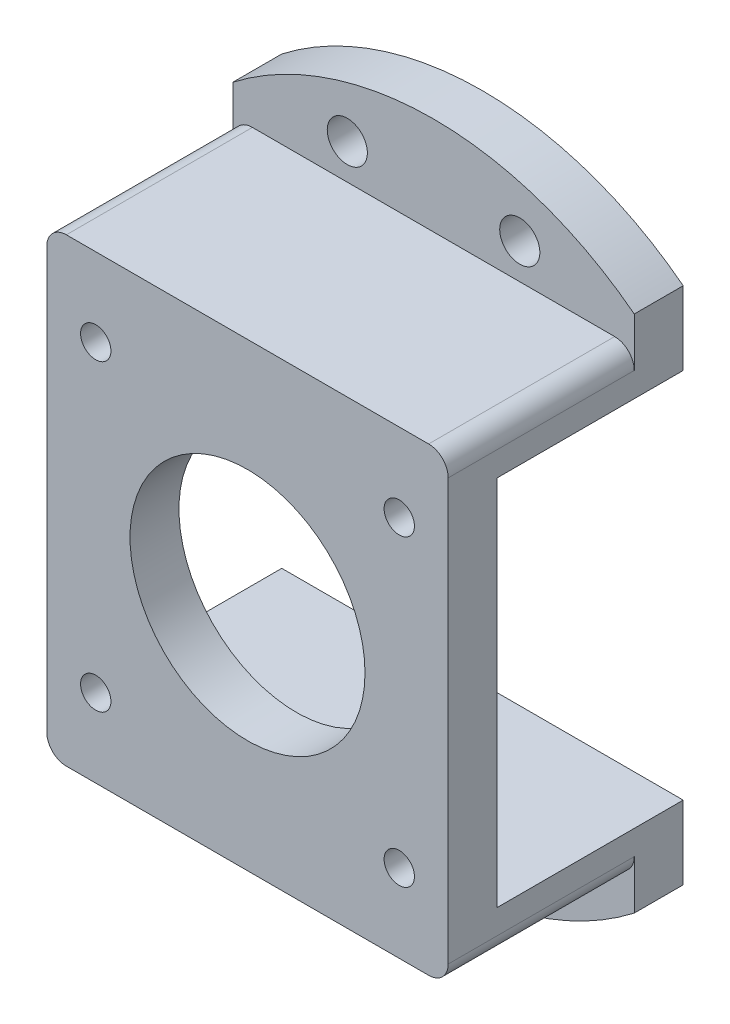
ISO-10303-21;
HEADER;
FILE_DESCRIPTION(('STEP AP214'),'2;1');
FILE_NAME('part.step','',(''),(''),'','','');
FILE_SCHEMA(('AUTOMOTIVE_DESIGN { 1 0 10303 214 1 1 1 1 }'));
ENDSEC;
DATA;
#1=APPLICATION_CONTEXT('core data for automotive mechanical design processes');
#2=APPLICATION_PROTOCOL_DEFINITION('international standard','automotive_design',2000,#1);
#3=PRODUCT_CONTEXT('',#1,'mechanical');
#4=PRODUCT('Part','Part','',(#3));
#5=PRODUCT_RELATED_PRODUCT_CATEGORY('part','',(#4));
#6=PRODUCT_DEFINITION_FORMATION('','',#4);
#7=PRODUCT_DEFINITION_CONTEXT('part definition',#1,'design');
#8=PRODUCT_DEFINITION('design','',#6,#7);
#9=PRODUCT_DEFINITION_SHAPE('','',#8);
#10=(LENGTH_UNIT() NAMED_UNIT(*) SI_UNIT(.MILLI.,.METRE.));
#11=(NAMED_UNIT(*) PLANE_ANGLE_UNIT() SI_UNIT($,.RADIAN.));
#12=(NAMED_UNIT(*) SI_UNIT($,.STERADIAN.) SOLID_ANGLE_UNIT());
#13=UNCERTAINTY_MEASURE_WITH_UNIT(LENGTH_MEASURE(1.E-05),#10,'distance_accuracy_value','');
#14=(GEOMETRIC_REPRESENTATION_CONTEXT(3) GLOBAL_UNCERTAINTY_ASSIGNED_CONTEXT((#13)) GLOBAL_UNIT_ASSIGNED_CONTEXT((#10,
#11,#12)) REPRESENTATION_CONTEXT('',''));
#15=CARTESIAN_POINT('',(0.,0.,0.));
#16=DIRECTION('',(0.,0.,1.));
#17=DIRECTION('',(1.,0.,0.));
#18=AXIS2_PLACEMENT_3D('',#15,#16,#17);
#19=CARTESIAN_POINT('',(-20.5,23.5,-19.));
#20=DIRECTION('',(0.,1.,0.));
#21=DIRECTION('',(0.,0.,1.));
#22=AXIS2_PLACEMENT_3D('',#19,#20,#21);
#23=PLANE('',#22);
#24=DIRECTION('',(-1.,0.,0.));
#25=VECTOR('',#24,1.);
#26=CARTESIAN_POINT('',(0.,23.5,-14.));
#27=LINE('',#26,#25);
#28=CARTESIAN_POINT('',(18.5,23.5,-14.));
#29=VERTEX_POINT('',#28);
#30=CARTESIAN_POINT('',(-18.5,23.5,-14.));
#31=VERTEX_POINT('',#30);
#32=EDGE_CURVE('E210',#29,#31,#27,.T.);
#33=ORIENTED_EDGE('',*,*,#32,.T.);
#34=DIRECTION('',(0.,0.,1.));
#35=VECTOR('',#34,1.);
#36=CARTESIAN_POINT('',(-18.5,23.5,-19.));
#37=LINE('',#36,#35);
#38=CARTESIAN_POINT('',(-18.5,23.5,5.));
#39=VERTEX_POINT('',#38);
#40=EDGE_CURVE('E329',#31,#39,#37,.T.);
#41=ORIENTED_EDGE('',*,*,#40,.T.);
#42=DIRECTION('',(-1.,0.,0.));
#43=VECTOR('',#42,1.);
#44=CARTESIAN_POINT('',(-20.5,23.5,5.));
#45=LINE('',#44,#43);
#46=CARTESIAN_POINT('',(18.5,23.5,5.));
#47=VERTEX_POINT('',#46);
#48=EDGE_CURVE('E239',#47,#39,#45,.T.);
#49=ORIENTED_EDGE('',*,*,#48,.F.);
#50=DIRECTION('',(0.,0.,1.));
#51=VECTOR('',#50,1.);
#52=CARTESIAN_POINT('',(18.5,23.5,-14.));
#53=LINE('',#52,#51);
#54=EDGE_CURVE('E57',#47,#29,#53,.F.);
#55=ORIENTED_EDGE('',*,*,#54,.T.);
#56=EDGE_LOOP('',(#33,#41,#49,#55));
#57=FACE_BOUND('',#56,.T.);
#58=ADVANCED_FACE('F36',(#57),#23,.T.);
#59=CARTESIAN_POINT('',(20.5,0.,5.));
#60=DIRECTION('',(-1.,0.,0.));
#61=DIRECTION('',(0.,0.,1.));
#62=AXIS2_PLACEMENT_3D('',#59,#60,#61);
#63=PLANE('',#62);
#64=DIRECTION('',(0.,1.,0.));
#65=VECTOR('',#64,1.);
#66=CARTESIAN_POINT('',(20.5,0.,5.));
#67=LINE('',#66,#65);
#68=CARTESIAN_POINT('',(20.5,-21.5,5.));
#69=VERTEX_POINT('',#68);
#70=CARTESIAN_POINT('',(20.5,21.5,5.));
#71=VERTEX_POINT('',#70);
#72=EDGE_CURVE('E274',#69,#71,#67,.T.);
#73=ORIENTED_EDGE('',*,*,#72,.F.);
#74=DIRECTION('',(0.,0.,1.));
#75=VECTOR('',#74,1.);
#76=CARTESIAN_POINT('',(20.5,-21.5,-14.));
#77=LINE('',#76,#75);
#78=CARTESIAN_POINT('',(20.5,-21.5,-14.));
#79=VERTEX_POINT('',#78);
#80=EDGE_CURVE('E174',#69,#79,#77,.F.);
#81=ORIENTED_EDGE('',*,*,#80,.T.);
#82=DIRECTION('',(0.,-1.,0.));
#83=VECTOR('',#82,1.);
#84=CARTESIAN_POINT('',(20.5,0.,-14.));
#85=LINE('',#84,#83);
#86=CARTESIAN_POINT('',(20.5,-26.4952825989835,-14.));
#87=VERTEX_POINT('',#86);
#88=EDGE_CURVE('E165',#79,#87,#85,.T.);
#89=ORIENTED_EDGE('',*,*,#88,.T.);
#90=DIRECTION('',(0.,0.,-1.));
#91=VECTOR('',#90,1.);
#92=CARTESIAN_POINT('',(20.5,-26.4952825989835,-14.));
#93=LINE('',#92,#91);
#94=CARTESIAN_POINT('',(20.5,-26.4952825989835,-19.));
#95=VERTEX_POINT('',#94);
#96=EDGE_CURVE('E150',#87,#95,#93,.T.);
#97=ORIENTED_EDGE('',*,*,#96,.T.);
#98=DIRECTION('',(0.,1.,0.));
#99=VECTOR('',#98,1.);
#100=CARTESIAN_POINT('',(20.5,-19.,-19.));
#101=LINE('',#100,#99);
#102=CARTESIAN_POINT('',(20.5,-19.,-19.));
#103=VERTEX_POINT('',#102);
#104=EDGE_CURVE('E228',#95,#103,#101,.T.);
#105=ORIENTED_EDGE('',*,*,#104,.T.);
#106=DIRECTION('',(0.,0.,1.));
#107=VECTOR('',#106,1.);
#108=CARTESIAN_POINT('',(20.5,-19.,-19.));
#109=LINE('',#108,#107);
#110=CARTESIAN_POINT('',(20.5,-19.,0.));
#111=VERTEX_POINT('',#110);
#112=EDGE_CURVE('E233',#103,#111,#109,.T.);
#113=ORIENTED_EDGE('',*,*,#112,.T.);
#114=DIRECTION('',(0.,1.,0.));
#115=VECTOR('',#114,1.);
#116=CARTESIAN_POINT('',(20.5,0.,0.));
#117=LINE('',#116,#115);
#118=CARTESIAN_POINT('',(20.5,19.,0.));
#119=VERTEX_POINT('',#118);
#120=EDGE_CURVE('E298',#111,#119,#117,.T.);
#121=ORIENTED_EDGE('',*,*,#120,.T.);
#122=DIRECTION('',(0.,0.,1.));
#123=VECTOR('',#122,1.);
#124=CARTESIAN_POINT('',(20.5,19.,-19.));
#125=LINE('',#124,#123);
#126=CARTESIAN_POINT('',(20.5,19.,-19.));
#127=VERTEX_POINT('',#126);
#128=EDGE_CURVE('E253',#127,#119,#125,.T.);
#129=ORIENTED_EDGE('',*,*,#128,.F.);
#130=DIRECTION('',(0.,1.,0.));
#131=VECTOR('',#130,1.);
#132=CARTESIAN_POINT('',(20.5,19.,-19.));
#133=LINE('',#132,#131);
#134=CARTESIAN_POINT('',(20.5,26.4952825989835,-19.));
#135=VERTEX_POINT('',#134);
#136=EDGE_CURVE('E248',#127,#135,#133,.T.);
#137=ORIENTED_EDGE('',*,*,#136,.T.);
#138=DIRECTION('',(0.,0.,-1.));
#139=VECTOR('',#138,1.);
#140=CARTESIAN_POINT('',(20.5,26.4952825989835,-14.));
#141=LINE('',#140,#139);
#142=CARTESIAN_POINT('',(20.5,26.4952825989835,-14.));
#143=VERTEX_POINT('',#142);
#144=EDGE_CURVE('E220',#143,#135,#141,.T.);
#145=ORIENTED_EDGE('',*,*,#144,.F.);
#146=DIRECTION('',(0.,1.,0.));
#147=VECTOR('',#146,1.);
#148=CARTESIAN_POINT('',(20.5,0.,-14.));
#149=LINE('',#148,#147);
#150=CARTESIAN_POINT('',(20.5,21.5,-14.));
#151=VERTEX_POINT('',#150);
#152=EDGE_CURVE('E208',#151,#143,#149,.T.);
#153=ORIENTED_EDGE('',*,*,#152,.F.);
#154=DIRECTION('',(0.,0.,1.));
#155=VECTOR('',#154,1.);
#156=CARTESIAN_POINT('',(20.5,21.5,5.));
#157=LINE('',#156,#155);
#158=EDGE_CURVE('E324',#151,#71,#157,.T.);
#159=ORIENTED_EDGE('',*,*,#158,.T.);
#160=EDGE_LOOP('',(#73,#81,#89,#97,#105,#113,#121,#129,#137,#145,#153,#159));
#161=FACE_BOUND('',#160,.T.);
#162=ADVANCED_FACE('F172',(#161),#63,.F.);
#163=CARTESIAN_POINT('',(15.5,15.5,5.));
#164=DIRECTION('',(0.,0.,-1.));
#165=DIRECTION('',(-1.,0.,0.));
#166=AXIS2_PLACEMENT_3D('',#163,#164,#165);
#167=CYLINDRICAL_SURFACE('',#166,1.55);
#168=CARTESIAN_POINT('',(15.5,15.5,5.));
#169=DIRECTION('',(0.,0.,1.));
#170=DIRECTION('',(1.,0.,0.));
#171=AXIS2_PLACEMENT_3D('',#168,#169,#170);
#172=CIRCLE('',#171,1.55);
#173=CARTESIAN_POINT('',(17.05,15.5,5.));
#174=VERTEX_POINT('',#173);
#175=EDGE_CURVE('E271',#174,#174,#172,.T.);
#176=ORIENTED_EDGE('',*,*,#175,.T.);
#177=EDGE_LOOP('',(#176));
#178=FACE_BOUND('',#177,.T.);
#179=CARTESIAN_POINT('',(15.5,15.5,0.));
#180=DIRECTION('',(0.,0.,1.));
#181=DIRECTION('',(1.,0.,0.));
#182=AXIS2_PLACEMENT_3D('',#179,#180,#181);
#183=CIRCLE('',#182,1.55);
#184=CARTESIAN_POINT('',(17.05,15.5,0.));
#185=VERTEX_POINT('',#184);
#186=EDGE_CURVE('E292',#185,#185,#183,.T.);
#187=ORIENTED_EDGE('',*,*,#186,.F.);
#188=EDGE_LOOP('',(#187));
#189=FACE_BOUND('',#188,.T.);
#190=ADVANCED_FACE('F375',(#178,#189),#167,.F.);
#191=CARTESIAN_POINT('',(-15.5,15.5,5.));
#192=DIRECTION('',(0.,0.,-1.));
#193=DIRECTION('',(-1.,0.,0.));
#194=AXIS2_PLACEMENT_3D('',#191,#192,#193);
#195=CYLINDRICAL_SURFACE('',#194,1.55);
#196=CARTESIAN_POINT('',(-15.5,15.5,5.));
#197=DIRECTION('',(0.,0.,1.));
#198=DIRECTION('',(1.,0.,0.));
#199=AXIS2_PLACEMENT_3D('',#196,#197,#198);
#200=CIRCLE('',#199,1.55);
#201=CARTESIAN_POINT('',(-13.95,15.5,5.));
#202=VERTEX_POINT('',#201);
#203=EDGE_CURVE('E268',#202,#202,#200,.T.);
#204=ORIENTED_EDGE('',*,*,#203,.T.);
#205=EDGE_LOOP('',(#204));
#206=FACE_BOUND('',#205,.T.);
#207=CARTESIAN_POINT('',(-15.5,15.5,0.));
#208=DIRECTION('',(0.,0.,1.));
#209=DIRECTION('',(1.,0.,0.));
#210=AXIS2_PLACEMENT_3D('',#207,#208,#209);
#211=CIRCLE('',#210,1.55);
#212=CARTESIAN_POINT('',(-13.95,15.5,0.));
#213=VERTEX_POINT('',#212);
#214=EDGE_CURVE('E289',#213,#213,#211,.T.);
#215=ORIENTED_EDGE('',*,*,#214,.F.);
#216=EDGE_LOOP('',(#215));
#217=FACE_BOUND('',#216,.T.);
#218=ADVANCED_FACE('F397',(#206,#217),#195,.F.);
#219=CARTESIAN_POINT('',(15.5,-15.5,5.));
#220=DIRECTION('',(0.,0.,-1.));
#221=DIRECTION('',(-1.,0.,0.));
#222=AXIS2_PLACEMENT_3D('',#219,#220,#221);
#223=CYLINDRICAL_SURFACE('',#222,1.55);
#224=CARTESIAN_POINT('',(15.5,-15.5,5.));
#225=DIRECTION('',(0.,0.,1.));
#226=DIRECTION('',(1.,0.,0.));
#227=AXIS2_PLACEMENT_3D('',#224,#225,#226);
#228=CIRCLE('',#227,1.55);
#229=CARTESIAN_POINT('',(17.05,-15.5,5.));
#230=VERTEX_POINT('',#229);
#231=EDGE_CURVE('E265',#230,#230,#228,.T.);
#232=ORIENTED_EDGE('',*,*,#231,.T.);
#233=EDGE_LOOP('',(#232));
#234=FACE_BOUND('',#233,.T.);
#235=CARTESIAN_POINT('',(15.5,-15.5,0.));
#236=DIRECTION('',(0.,0.,1.));
#237=DIRECTION('',(1.,0.,0.));
#238=AXIS2_PLACEMENT_3D('',#235,#236,#237);
#239=CIRCLE('',#238,1.55);
#240=CARTESIAN_POINT('',(17.05,-15.5,0.));
#241=VERTEX_POINT('',#240);
#242=EDGE_CURVE('E286',#241,#241,#239,.T.);
#243=ORIENTED_EDGE('',*,*,#242,.F.);
#244=EDGE_LOOP('',(#243));
#245=FACE_BOUND('',#244,.T.);
#246=ADVANCED_FACE('F401',(#234,#245),#223,.F.);
#247=CARTESIAN_POINT('',(-15.5,-15.5,5.));
#248=DIRECTION('',(0.,0.,-1.));
#249=DIRECTION('',(-1.,0.,0.));
#250=AXIS2_PLACEMENT_3D('',#247,#248,#249);
#251=CYLINDRICAL_SURFACE('',#250,1.55);
#252=CARTESIAN_POINT('',(-15.5,-15.5,5.));
#253=DIRECTION('',(0.,0.,1.));
#254=DIRECTION('',(1.,0.,0.));
#255=AXIS2_PLACEMENT_3D('',#252,#253,#254);
#256=CIRCLE('',#255,1.55);
#257=CARTESIAN_POINT('',(-13.95,-15.5,5.));
#258=VERTEX_POINT('',#257);
#259=EDGE_CURVE('E261',#258,#258,#256,.T.);
#260=ORIENTED_EDGE('',*,*,#259,.T.);
#261=EDGE_LOOP('',(#260));
#262=FACE_BOUND('',#261,.T.);
#263=CARTESIAN_POINT('',(-15.5,-15.5,0.));
#264=DIRECTION('',(0.,0.,1.));
#265=DIRECTION('',(1.,0.,0.));
#266=AXIS2_PLACEMENT_3D('',#263,#264,#265);
#267=CIRCLE('',#266,1.55);
#268=CARTESIAN_POINT('',(-13.95,-15.5,0.));
#269=VERTEX_POINT('',#268);
#270=EDGE_CURVE('E283',#269,#269,#267,.T.);
#271=ORIENTED_EDGE('',*,*,#270,.F.);
#272=EDGE_LOOP('',(#271));
#273=FACE_BOUND('',#272,.T.);
#274=ADVANCED_FACE('F405',(#262,#273),#251,.F.);
#275=CARTESIAN_POINT('',(0.,0.,5.));
#276=DIRECTION('',(0.,0.,-1.));
#277=DIRECTION('',(-1.,0.,0.));
#278=AXIS2_PLACEMENT_3D('',#275,#276,#277);
#279=CYLINDRICAL_SURFACE('',#278,12.);
#280=CARTESIAN_POINT('',(0.,0.,5.));
#281=DIRECTION('',(0.,0.,1.));
#282=DIRECTION('',(1.,0.,0.));
#283=AXIS2_PLACEMENT_3D('',#280,#281,#282);
#284=CIRCLE('',#283,12.);
#285=CARTESIAN_POINT('',(12.,0.,5.));
#286=VERTEX_POINT('',#285);
#287=EDGE_CURVE('E258',#286,#286,#284,.T.);
#288=ORIENTED_EDGE('',*,*,#287,.T.);
#289=EDGE_LOOP('',(#288));
#290=FACE_BOUND('',#289,.T.);
#291=CARTESIAN_POINT('',(0.,0.,0.));
#292=DIRECTION('',(0.,0.,1.));
#293=DIRECTION('',(1.,0.,0.));
#294=AXIS2_PLACEMENT_3D('',#291,#292,#293);
#295=CIRCLE('',#294,12.);
#296=CARTESIAN_POINT('',(12.,0.,0.));
#297=VERTEX_POINT('',#296);
#298=EDGE_CURVE('E255',#297,#297,#295,.T.);
#299=ORIENTED_EDGE('',*,*,#298,.F.);
#300=EDGE_LOOP('',(#299));
#301=FACE_BOUND('',#300,.T.);
#302=ADVANCED_FACE('F393',(#290,#301),#279,.F.);
#303=CARTESIAN_POINT('',(-20.5,0.,5.));
#304=DIRECTION('',(-1.,0.,0.));
#305=DIRECTION('',(0.,0.,1.));
#306=AXIS2_PLACEMENT_3D('',#303,#304,#305);
#307=PLANE('',#306);
#308=DIRECTION('',(0.,-1.,0.));
#309=VECTOR('',#308,1.);
#310=CARTESIAN_POINT('',(-20.5,0.,-14.));
#311=LINE('',#310,#309);
#312=CARTESIAN_POINT('',(-20.5,-21.5,-14.));
#313=VERTEX_POINT('',#312);
#314=CARTESIAN_POINT('',(-20.5,-26.4952825989835,-14.));
#315=VERTEX_POINT('',#314);
#316=EDGE_CURVE('E168',#313,#315,#311,.T.);
#317=ORIENTED_EDGE('',*,*,#316,.F.);
#318=DIRECTION('',(0.,0.,1.));
#319=VECTOR('',#318,1.);
#320=CARTESIAN_POINT('',(-20.5,-21.5,5.));
#321=LINE('',#320,#319);
#322=CARTESIAN_POINT('',(-20.5,-21.5,5.));
#323=VERTEX_POINT('',#322);
#324=EDGE_CURVE('E308',#313,#323,#321,.T.);
#325=ORIENTED_EDGE('',*,*,#324,.T.);
#326=DIRECTION('',(0.,1.,0.));
#327=VECTOR('',#326,1.);
#328=CARTESIAN_POINT('',(-20.5,0.,5.));
#329=LINE('',#328,#327);
#330=CARTESIAN_POINT('',(-20.5,21.5,5.));
#331=VERTEX_POINT('',#330);
#332=EDGE_CURVE('E277',#323,#331,#329,.T.);
#333=ORIENTED_EDGE('',*,*,#332,.T.);
#334=DIRECTION('',(0.,0.,1.));
#335=VECTOR('',#334,1.);
#336=CARTESIAN_POINT('',(-20.5,21.5,5.));
#337=LINE('',#336,#335);
#338=CARTESIAN_POINT('',(-20.5,21.5,-14.));
#339=VERTEX_POINT('',#338);
#340=EDGE_CURVE('E280',#331,#339,#337,.F.);
#341=ORIENTED_EDGE('',*,*,#340,.T.);
#342=DIRECTION('',(0.,1.,0.));
#343=VECTOR('',#342,1.);
#344=CARTESIAN_POINT('',(-20.5,0.,-14.));
#345=LINE('',#344,#343);
#346=CARTESIAN_POINT('',(-20.5,26.4952825989835,-14.));
#347=VERTEX_POINT('',#346);
#348=EDGE_CURVE('E202',#339,#347,#345,.T.);
#349=ORIENTED_EDGE('',*,*,#348,.T.);
#350=DIRECTION('',(0.,0.,-1.));
#351=VECTOR('',#350,1.);
#352=CARTESIAN_POINT('',(-20.5,26.4952825989835,-14.));
#353=LINE('',#352,#351);
#354=CARTESIAN_POINT('',(-20.5,26.4952825989835,-19.));
#355=VERTEX_POINT('',#354);
#356=EDGE_CURVE('E212',#347,#355,#353,.T.);
#357=ORIENTED_EDGE('',*,*,#356,.T.);
#358=DIRECTION('',(0.,-1.,0.));
#359=VECTOR('',#358,1.);
#360=CARTESIAN_POINT('',(-20.5,19.,-19.));
#361=LINE('',#360,#359);
#362=CARTESIAN_POINT('',(-20.5,19.,-19.));
#363=VERTEX_POINT('',#362);
#364=EDGE_CURVE('E242',#355,#363,#361,.T.);
#365=ORIENTED_EDGE('',*,*,#364,.T.);
#366=DIRECTION('',(0.,0.,1.));
#367=VECTOR('',#366,1.);
#368=CARTESIAN_POINT('',(-20.5,19.,-19.));
#369=LINE('',#368,#367);
#370=CARTESIAN_POINT('',(-20.5,19.,0.));
#371=VERTEX_POINT('',#370);
#372=EDGE_CURVE('E250',#363,#371,#369,.T.);
#373=ORIENTED_EDGE('',*,*,#372,.T.);
#374=DIRECTION('',(0.,1.,0.));
#375=VECTOR('',#374,1.);
#376=CARTESIAN_POINT('',(-20.5,0.,0.));
#377=LINE('',#376,#375);
#378=CARTESIAN_POINT('',(-20.5,-19.,0.));
#379=VERTEX_POINT('',#378);
#380=EDGE_CURVE('E262',#379,#371,#377,.T.);
#381=ORIENTED_EDGE('',*,*,#380,.F.);
#382=DIRECTION('',(0.,0.,1.));
#383=VECTOR('',#382,1.);
#384=CARTESIAN_POINT('',(-20.5,-19.,-19.));
#385=LINE('',#384,#383);
#386=CARTESIAN_POINT('',(-20.5,-19.,-19.));
#387=VERTEX_POINT('',#386);
#388=EDGE_CURVE('E236',#387,#379,#385,.T.);
#389=ORIENTED_EDGE('',*,*,#388,.F.);
#390=DIRECTION('',(0.,-1.,0.));
#391=VECTOR('',#390,1.);
#392=CARTESIAN_POINT('',(-20.5,-19.,-19.));
#393=LINE('',#392,#391);
#394=CARTESIAN_POINT('',(-20.5,-26.4952825989835,-19.));
#395=VERTEX_POINT('',#394);
#396=EDGE_CURVE('E226',#387,#395,#393,.T.);
#397=ORIENTED_EDGE('',*,*,#396,.T.);
#398=DIRECTION('',(0.,0.,-1.));
#399=VECTOR('',#398,1.);
#400=CARTESIAN_POINT('',(-20.5,-26.4952825989835,-14.));
#401=LINE('',#400,#399);
#402=EDGE_CURVE('E160',#315,#395,#401,.T.);
#403=ORIENTED_EDGE('',*,*,#402,.F.);
#404=EDGE_LOOP('',(#317,#325,#333,#341,#349,#357,#365,#373,#381,#389,#397,#403));
#405=FACE_BOUND('',#404,.T.);
#406=ADVANCED_FACE('F356',(#405),#307,.T.);
#407=CARTESIAN_POINT('',(0.,0.,5.));
#408=DIRECTION('',(0.,0.,1.));
#409=DIRECTION('',(1.,0.,0.));
#410=AXIS2_PLACEMENT_3D('',#407,#408,#409);
#411=PLANE('',#410);
#412=ORIENTED_EDGE('',*,*,#287,.F.);
#413=EDGE_LOOP('',(#412));
#414=FACE_BOUND('',#413,.T.);
#415=ORIENTED_EDGE('',*,*,#259,.F.);
#416=EDGE_LOOP('',(#415));
#417=FACE_BOUND('',#416,.T.);
#418=ORIENTED_EDGE('',*,*,#231,.F.);
#419=EDGE_LOOP('',(#418));
#420=FACE_BOUND('',#419,.T.);
#421=ORIENTED_EDGE('',*,*,#203,.F.);
#422=EDGE_LOOP('',(#421));
#423=FACE_BOUND('',#422,.T.);
#424=ORIENTED_EDGE('',*,*,#175,.F.);
#425=EDGE_LOOP('',(#424));
#426=FACE_BOUND('',#425,.T.);
#427=ORIENTED_EDGE('',*,*,#332,.F.);
#428=CARTESIAN_POINT('',(-18.5,-21.5,5.));
#429=DIRECTION('',(0.,0.,1.));
#430=DIRECTION('',(1.,0.,0.));
#431=AXIS2_PLACEMENT_3D('',#428,#429,#430);
#432=CIRCLE('',#431,2.);
#433=CARTESIAN_POINT('',(-18.5,-23.5,5.));
#434=VERTEX_POINT('',#433);
#435=EDGE_CURVE('E317',#323,#434,#432,.T.);
#436=ORIENTED_EDGE('',*,*,#435,.T.);
#437=DIRECTION('',(1.,0.,0.));
#438=VECTOR('',#437,1.);
#439=CARTESIAN_POINT('',(-20.5,-23.5,5.));
#440=LINE('',#439,#438);
#441=CARTESIAN_POINT('',(18.5,-23.5,5.));
#442=VERTEX_POINT('',#441);
#443=EDGE_CURVE('E223',#434,#442,#440,.T.);
#444=ORIENTED_EDGE('',*,*,#443,.T.);
#445=CARTESIAN_POINT('',(18.5,-21.5,5.));
#446=DIRECTION('',(0.,0.,1.));
#447=DIRECTION('',(1.,0.,0.));
#448=AXIS2_PLACEMENT_3D('',#445,#446,#447);
#449=CIRCLE('',#448,2.);
#450=EDGE_CURVE('E315',#442,#69,#449,.T.);
#451=ORIENTED_EDGE('',*,*,#450,.T.);
#452=ORIENTED_EDGE('',*,*,#72,.T.);
#453=CARTESIAN_POINT('',(18.5,21.5,5.));
#454=DIRECTION('',(0.,0.,1.));
#455=DIRECTION('',(1.,0.,0.));
#456=AXIS2_PLACEMENT_3D('',#453,#454,#455);
#457=CIRCLE('',#456,2.);
#458=EDGE_CURVE('E311',#71,#47,#457,.T.);
#459=ORIENTED_EDGE('',*,*,#458,.T.);
#460=ORIENTED_EDGE('',*,*,#48,.T.);
#461=CARTESIAN_POINT('',(-18.5,21.5,5.));
#462=DIRECTION('',(0.,0.,1.));
#463=DIRECTION('',(1.,0.,0.));
#464=AXIS2_PLACEMENT_3D('',#461,#462,#463);
#465=CIRCLE('',#464,2.);
#466=EDGE_CURVE('E313',#39,#331,#465,.T.);
#467=ORIENTED_EDGE('',*,*,#466,.T.);
#468=EDGE_LOOP('',(#427,#436,#444,#451,#452,#459,#460,#467));
#469=FACE_BOUND('',#468,.T.);
#470=ADVANCED_FACE('F346',(#414,#417,#420,#423,#426,#469),#411,.T.);
#471=CARTESIAN_POINT('',(0.,0.,0.));
#472=DIRECTION('',(0.,0.,1.));
#473=DIRECTION('',(1.,0.,0.));
#474=AXIS2_PLACEMENT_3D('',#471,#472,#473);
#475=PLANE('',#474);
#476=ORIENTED_EDGE('',*,*,#298,.T.);
#477=EDGE_LOOP('',(#476));
#478=FACE_BOUND('',#477,.T.);
#479=ORIENTED_EDGE('',*,*,#270,.T.);
#480=EDGE_LOOP('',(#479));
#481=FACE_BOUND('',#480,.T.);
#482=ORIENTED_EDGE('',*,*,#242,.T.);
#483=EDGE_LOOP('',(#482));
#484=FACE_BOUND('',#483,.T.);
#485=ORIENTED_EDGE('',*,*,#214,.T.);
#486=EDGE_LOOP('',(#485));
#487=FACE_BOUND('',#486,.T.);
#488=ORIENTED_EDGE('',*,*,#186,.T.);
#489=EDGE_LOOP('',(#488));
#490=FACE_BOUND('',#489,.T.);
#491=DIRECTION('',(1.,0.,0.));
#492=VECTOR('',#491,1.);
#493=CARTESIAN_POINT('',(0.,-19.,0.));
#494=LINE('',#493,#492);
#495=EDGE_CURVE('E295',#379,#111,#494,.T.);
#496=ORIENTED_EDGE('',*,*,#495,.F.);
#497=ORIENTED_EDGE('',*,*,#380,.T.);
#498=DIRECTION('',(1.,0.,0.));
#499=VECTOR('',#498,1.);
#500=CARTESIAN_POINT('',(0.,19.,0.));
#501=LINE('',#500,#499);
#502=EDGE_CURVE('E301',#371,#119,#501,.T.);
#503=ORIENTED_EDGE('',*,*,#502,.T.);
#504=ORIENTED_EDGE('',*,*,#120,.F.);
#505=EDGE_LOOP('',(#496,#497,#503,#504));
#506=FACE_BOUND('',#505,.T.);
#507=ADVANCED_FACE('F384',(#478,#481,#484,#487,#490,#506),#475,.F.);
#508=CARTESIAN_POINT('',(-20.5,19.,-19.));
#509=DIRECTION('',(0.,-1.,0.));
#510=DIRECTION('',(0.,0.,-1.));
#511=AXIS2_PLACEMENT_3D('',#508,#509,#510);
#512=PLANE('',#511);
#513=ORIENTED_EDGE('',*,*,#502,.F.);
#514=ORIENTED_EDGE('',*,*,#372,.F.);
#515=DIRECTION('',(1.,0.,0.));
#516=VECTOR('',#515,1.);
#517=CARTESIAN_POINT('',(-20.5,19.,-19.));
#518=LINE('',#517,#516);
#519=EDGE_CURVE('E245',#363,#127,#518,.T.);
#520=ORIENTED_EDGE('',*,*,#519,.T.);
#521=ORIENTED_EDGE('',*,*,#128,.T.);
#522=EDGE_LOOP('',(#513,#514,#520,#521));
#523=FACE_BOUND('',#522,.T.);
#524=ADVANCED_FACE('F381',(#523),#512,.T.);
#525=CARTESIAN_POINT('',(0.,0.,-19.));
#526=DIRECTION('',(0.,0.,-1.));
#527=DIRECTION('',(-1.,0.,0.));
#528=AXIS2_PLACEMENT_3D('',#525,#526,#527);
#529=PLANE('',#528);
#530=ORIENTED_EDGE('',*,*,#364,.F.);
#531=CARTESIAN_POINT('',(0.,0.,-19.));
#532=DIRECTION('',(0.,0.,-1.));
#533=DIRECTION('',(-1.,0.,0.));
#534=AXIS2_PLACEMENT_3D('',#531,#532,#533);
#535=CIRCLE('',#534,33.5);
#536=EDGE_CURVE('E199',#355,#135,#535,.T.);
#537=ORIENTED_EDGE('',*,*,#536,.T.);
#538=ORIENTED_EDGE('',*,*,#136,.F.);
#539=ORIENTED_EDGE('',*,*,#519,.F.);
#540=EDGE_LOOP('',(#530,#537,#538,#539));
#541=FACE_BOUND('',#540,.T.);
#542=CARTESIAN_POINT('',(-8.80698433968602,27.1051107144119,-19.));
#543=DIRECTION('',(0.,0.,-1.));
#544=DIRECTION('',(-1.,0.,0.));
#545=AXIS2_PLACEMENT_3D('',#542,#543,#544);
#546=CIRCLE('',#545,2.05);
#547=CARTESIAN_POINT('',(-10.856984339686,27.1051107144119,-19.));
#548=VERTEX_POINT('',#547);
#549=EDGE_CURVE('E193',#548,#548,#546,.T.);
#550=ORIENTED_EDGE('',*,*,#549,.F.);
#551=EDGE_LOOP('',(#550));
#552=FACE_BOUND('',#551,.T.);
#553=CARTESIAN_POINT('',(8.80698433968602,27.1051107144119,-19.));
#554=DIRECTION('',(0.,0.,-1.));
#555=DIRECTION('',(-1.,0.,0.));
#556=AXIS2_PLACEMENT_3D('',#553,#554,#555);
#557=CIRCLE('',#556,2.05);
#558=CARTESIAN_POINT('',(6.75698433968602,27.1051107144119,-19.));
#559=VERTEX_POINT('',#558);
#560=EDGE_CURVE('E215',#559,#559,#557,.F.);
#561=ORIENTED_EDGE('',*,*,#560,.T.);
#562=EDGE_LOOP('',(#561));
#563=FACE_BOUND('',#562,.T.);
#564=ADVANCED_FACE('F379',(#541,#552,#563),#529,.T.);
#565=CARTESIAN_POINT('',(-20.5,-19.,-19.));
#566=DIRECTION('',(0.,1.,0.));
#567=DIRECTION('',(0.,0.,1.));
#568=AXIS2_PLACEMENT_3D('',#565,#566,#567);
#569=PLANE('',#568);
#570=ORIENTED_EDGE('',*,*,#388,.T.);
#571=ORIENTED_EDGE('',*,*,#495,.T.);
#572=ORIENTED_EDGE('',*,*,#112,.F.);
#573=DIRECTION('',(-1.,0.,0.));
#574=VECTOR('',#573,1.);
#575=CARTESIAN_POINT('',(-20.5,-19.,-19.));
#576=LINE('',#575,#574);
#577=EDGE_CURVE('E230',#103,#387,#576,.T.);
#578=ORIENTED_EDGE('',*,*,#577,.T.);
#579=EDGE_LOOP('',(#570,#571,#572,#578));
#580=FACE_BOUND('',#579,.T.);
#581=ADVANCED_FACE('F428',(#580),#569,.T.);
#582=CARTESIAN_POINT('',(-20.5,-23.5,-19.));
#583=DIRECTION('',(0.,-1.,0.));
#584=DIRECTION('',(0.,0.,-1.));
#585=AXIS2_PLACEMENT_3D('',#582,#583,#584);
#586=PLANE('',#585);
#587=ORIENTED_EDGE('',*,*,#443,.F.);
#588=DIRECTION('',(0.,0.,1.));
#589=VECTOR('',#588,1.);
#590=CARTESIAN_POINT('',(-18.5,-23.5,-19.));
#591=LINE('',#590,#589);
#592=CARTESIAN_POINT('',(-18.5,-23.5,-14.));
#593=VERTEX_POINT('',#592);
#594=EDGE_CURVE('E322',#434,#593,#591,.F.);
#595=ORIENTED_EDGE('',*,*,#594,.T.);
#596=DIRECTION('',(-1.,0.,0.));
#597=VECTOR('',#596,1.);
#598=CARTESIAN_POINT('',(0.,-23.5,-14.));
#599=LINE('',#598,#597);
#600=CARTESIAN_POINT('',(18.5,-23.5,-14.));
#601=VERTEX_POINT('',#600);
#602=EDGE_CURVE('E161',#601,#593,#599,.T.);
#603=ORIENTED_EDGE('',*,*,#602,.F.);
#604=DIRECTION('',(0.,0.,1.));
#605=VECTOR('',#604,1.);
#606=CARTESIAN_POINT('',(18.5,-23.5,5.));
#607=LINE('',#606,#605);
#608=EDGE_CURVE('E319',#601,#442,#607,.T.);
#609=ORIENTED_EDGE('',*,*,#608,.T.);
#610=EDGE_LOOP('',(#587,#595,#603,#609));
#611=FACE_BOUND('',#610,.T.);
#612=ADVANCED_FACE('F341',(#611),#586,.T.);
#613=CARTESIAN_POINT('',(0.,0.,-19.));
#614=DIRECTION('',(0.,0.,1.));
#615=DIRECTION('',(1.,0.,0.));
#616=AXIS2_PLACEMENT_3D('',#613,#614,#615);
#617=PLANE('',#616);
#618=ORIENTED_EDGE('',*,*,#396,.F.);
#619=ORIENTED_EDGE('',*,*,#577,.F.);
#620=ORIENTED_EDGE('',*,*,#104,.F.);
#621=CARTESIAN_POINT('',(0.,0.,-19.));
#622=DIRECTION('',(0.,0.,-1.));
#623=DIRECTION('',(-1.,0.,0.));
#624=AXIS2_PLACEMENT_3D('',#621,#622,#623);
#625=CIRCLE('',#624,33.5);
#626=EDGE_CURVE('E156',#95,#395,#625,.T.);
#627=ORIENTED_EDGE('',*,*,#626,.T.);
#628=EDGE_LOOP('',(#618,#619,#620,#627));
#629=FACE_BOUND('',#628,.T.);
#630=CARTESIAN_POINT('',(8.80698433968602,-27.1051107144119,-19.));
#631=DIRECTION('',(0.,0.,-1.));
#632=DIRECTION('',(-1.,0.,0.));
#633=AXIS2_PLACEMENT_3D('',#630,#631,#632);
#634=CIRCLE('',#633,2.05);
#635=CARTESIAN_POINT('',(6.75698433968602,-27.1051107144119,-19.));
#636=VERTEX_POINT('',#635);
#637=EDGE_CURVE('E186',#636,#636,#634,.T.);
#638=ORIENTED_EDGE('',*,*,#637,.F.);
#639=EDGE_LOOP('',(#638));
#640=FACE_BOUND('',#639,.T.);
#641=CARTESIAN_POINT('',(-8.80698433968602,-27.1051107144119,-19.));
#642=DIRECTION('',(0.,0.,-1.));
#643=DIRECTION('',(-1.,0.,0.));
#644=AXIS2_PLACEMENT_3D('',#641,#642,#643);
#645=CIRCLE('',#644,2.05);
#646=CARTESIAN_POINT('',(-10.856984339686,-27.1051107144119,-19.));
#647=VERTEX_POINT('',#646);
#648=EDGE_CURVE('E189',#647,#647,#645,.F.);
#649=ORIENTED_EDGE('',*,*,#648,.T.);
#650=EDGE_LOOP('',(#649));
#651=FACE_BOUND('',#650,.T.);
#652=ADVANCED_FACE('F431',(#629,#640,#651),#617,.F.);
#653=CARTESIAN_POINT('',(8.80698433968602,27.1051107144119,-14.));
#654=DIRECTION('',(0.,0.,-1.));
#655=DIRECTION('',(-1.,0.,0.));
#656=AXIS2_PLACEMENT_3D('',#653,#654,#655);
#657=CYLINDRICAL_SURFACE('',#656,2.05);
#658=CARTESIAN_POINT('',(8.80698433968602,27.1051107144119,-14.));
#659=DIRECTION('',(0.,0.,-1.));
#660=DIRECTION('',(-1.,0.,0.));
#661=AXIS2_PLACEMENT_3D('',#658,#659,#660);
#662=CIRCLE('',#661,2.05);
#663=CARTESIAN_POINT('',(6.75698433968602,27.1051107144119,-14.));
#664=VERTEX_POINT('',#663);
#665=EDGE_CURVE('E198',#664,#664,#662,.F.);
#666=ORIENTED_EDGE('',*,*,#665,.T.);
#667=EDGE_LOOP('',(#666));
#668=FACE_BOUND('',#667,.T.);
#669=ORIENTED_EDGE('',*,*,#560,.F.);
#670=EDGE_LOOP('',(#669));
#671=FACE_BOUND('',#670,.T.);
#672=ADVANCED_FACE('F458',(#668,#671),#657,.F.);
#673=CARTESIAN_POINT('',(-8.80698433968602,27.1051107144119,-14.));
#674=DIRECTION('',(0.,0.,-1.));
#675=DIRECTION('',(-1.,0.,0.));
#676=AXIS2_PLACEMENT_3D('',#673,#674,#675);
#677=CYLINDRICAL_SURFACE('',#676,2.05);
#678=CARTESIAN_POINT('',(-8.80698433968602,27.1051107144119,-14.));
#679=DIRECTION('',(0.,0.,-1.));
#680=DIRECTION('',(-1.,0.,0.));
#681=AXIS2_PLACEMENT_3D('',#678,#679,#680);
#682=CIRCLE('',#681,2.05);
#683=CARTESIAN_POINT('',(-10.856984339686,27.1051107144119,-14.));
#684=VERTEX_POINT('',#683);
#685=EDGE_CURVE('E195',#684,#684,#682,.T.);
#686=ORIENTED_EDGE('',*,*,#685,.F.);
#687=EDGE_LOOP('',(#686));
#688=FACE_BOUND('',#687,.T.);
#689=ORIENTED_EDGE('',*,*,#549,.T.);
#690=EDGE_LOOP('',(#689));
#691=FACE_BOUND('',#690,.T.);
#692=ADVANCED_FACE('F453',(#688,#691),#677,.F.);
#693=CARTESIAN_POINT('',(0.,0.,-14.));
#694=DIRECTION('',(0.,0.,-1.));
#695=DIRECTION('',(-1.,0.,0.));
#696=AXIS2_PLACEMENT_3D('',#693,#694,#695);
#697=CYLINDRICAL_SURFACE('',#696,33.5);
#698=ORIENTED_EDGE('',*,*,#536,.F.);
#699=ORIENTED_EDGE('',*,*,#356,.F.);
#700=CARTESIAN_POINT('',(0.,0.,-14.));
#701=DIRECTION('',(0.,0.,-1.));
#702=DIRECTION('',(-1.,0.,0.));
#703=AXIS2_PLACEMENT_3D('',#700,#701,#702);
#704=CIRCLE('',#703,33.5);
#705=EDGE_CURVE('E205',#347,#143,#704,.T.);
#706=ORIENTED_EDGE('',*,*,#705,.T.);
#707=ORIENTED_EDGE('',*,*,#144,.T.);
#708=EDGE_LOOP('',(#698,#699,#706,#707));
#709=FACE_BOUND('',#708,.T.);
#710=ADVANCED_FACE('F440',(#709),#697,.T.);
#711=CARTESIAN_POINT('',(0.,0.,-14.));
#712=DIRECTION('',(0.,0.,-1.));
#713=DIRECTION('',(-1.,0.,0.));
#714=AXIS2_PLACEMENT_3D('',#711,#712,#713);
#715=PLANE('',#714);
#716=ORIENTED_EDGE('',*,*,#685,.T.);
#717=EDGE_LOOP('',(#716));
#718=FACE_BOUND('',#717,.T.);
#719=ORIENTED_EDGE('',*,*,#665,.F.);
#720=EDGE_LOOP('',(#719));
#721=FACE_BOUND('',#720,.T.);
#722=ORIENTED_EDGE('',*,*,#348,.F.);
#723=CARTESIAN_POINT('',(-18.5,21.5,-14.));
#724=DIRECTION('',(0.,0.,-1.));
#725=DIRECTION('',(-1.,0.,0.));
#726=AXIS2_PLACEMENT_3D('',#723,#724,#725);
#727=CIRCLE('',#726,2.);
#728=EDGE_CURVE('E44',#339,#31,#727,.T.);
#729=ORIENTED_EDGE('',*,*,#728,.T.);
#730=ORIENTED_EDGE('',*,*,#32,.F.);
#731=CARTESIAN_POINT('',(18.5,21.5,-14.));
#732=DIRECTION('',(0.,0.,-1.));
#733=DIRECTION('',(-1.,0.,0.));
#734=AXIS2_PLACEMENT_3D('',#731,#732,#733);
#735=CIRCLE('',#734,2.);
#736=EDGE_CURVE('E11',#29,#151,#735,.T.);
#737=ORIENTED_EDGE('',*,*,#736,.T.);
#738=ORIENTED_EDGE('',*,*,#152,.T.);
#739=ORIENTED_EDGE('',*,*,#705,.F.);
#740=EDGE_LOOP('',(#722,#729,#730,#737,#738,#739));
#741=FACE_BOUND('',#740,.T.);
#742=ADVANCED_FACE('F441',(#718,#721,#741),#715,.F.);
#743=CARTESIAN_POINT('',(-8.80698433968602,-27.1051107144119,-14.));
#744=DIRECTION('',(0.,0.,-1.));
#745=DIRECTION('',(-1.,0.,0.));
#746=AXIS2_PLACEMENT_3D('',#743,#744,#745);
#747=CYLINDRICAL_SURFACE('',#746,2.05);
#748=CARTESIAN_POINT('',(-8.80698433968602,-27.1051107144119,-14.));
#749=DIRECTION('',(0.,0.,-1.));
#750=DIRECTION('',(-1.,0.,0.));
#751=AXIS2_PLACEMENT_3D('',#748,#749,#750);
#752=CIRCLE('',#751,2.05);
#753=CARTESIAN_POINT('',(-10.856984339686,-27.1051107144119,-14.));
#754=VERTEX_POINT('',#753);
#755=EDGE_CURVE('E176',#754,#754,#752,.F.);
#756=ORIENTED_EDGE('',*,*,#755,.T.);
#757=EDGE_LOOP('',(#756));
#758=FACE_BOUND('',#757,.T.);
#759=ORIENTED_EDGE('',*,*,#648,.F.);
#760=EDGE_LOOP('',(#759));
#761=FACE_BOUND('',#760,.T.);
#762=ADVANCED_FACE('F443',(#758,#761),#747,.F.);
#763=CARTESIAN_POINT('',(8.80698433968602,-27.1051107144119,-14.));
#764=DIRECTION('',(0.,0.,-1.));
#765=DIRECTION('',(-1.,0.,0.));
#766=AXIS2_PLACEMENT_3D('',#763,#764,#765);
#767=CYLINDRICAL_SURFACE('',#766,2.05);
#768=CARTESIAN_POINT('',(8.80698433968602,-27.1051107144119,-14.));
#769=DIRECTION('',(0.,0.,-1.));
#770=DIRECTION('',(-1.,0.,0.));
#771=AXIS2_PLACEMENT_3D('',#768,#769,#770);
#772=CIRCLE('',#771,2.05);
#773=CARTESIAN_POINT('',(6.75698433968602,-27.1051107144119,-14.));
#774=VERTEX_POINT('',#773);
#775=EDGE_CURVE('E179',#774,#774,#772,.T.);
#776=ORIENTED_EDGE('',*,*,#775,.F.);
#777=EDGE_LOOP('',(#776));
#778=FACE_BOUND('',#777,.T.);
#779=ORIENTED_EDGE('',*,*,#637,.T.);
#780=EDGE_LOOP('',(#779));
#781=FACE_BOUND('',#780,.T.);
#782=ADVANCED_FACE('F450',(#778,#781),#767,.F.);
#783=CARTESIAN_POINT('',(0.,0.,-14.));
#784=DIRECTION('',(0.,0.,-1.));
#785=DIRECTION('',(-1.,0.,0.));
#786=AXIS2_PLACEMENT_3D('',#783,#784,#785);
#787=CYLINDRICAL_SURFACE('',#786,33.5);
#788=ORIENTED_EDGE('',*,*,#626,.F.);
#789=ORIENTED_EDGE('',*,*,#96,.F.);
#790=CARTESIAN_POINT('',(0.,0.,-14.));
#791=DIRECTION('',(0.,0.,-1.));
#792=DIRECTION('',(-1.,0.,0.));
#793=AXIS2_PLACEMENT_3D('',#790,#791,#792);
#794=CIRCLE('',#793,33.5);
#795=EDGE_CURVE('E154',#87,#315,#794,.T.);
#796=ORIENTED_EDGE('',*,*,#795,.T.);
#797=ORIENTED_EDGE('',*,*,#402,.T.);
#798=EDGE_LOOP('',(#788,#789,#796,#797));
#799=FACE_BOUND('',#798,.T.);
#800=ADVANCED_FACE('F152',(#799),#787,.T.);
#801=CARTESIAN_POINT('',(0.,0.,-14.));
#802=DIRECTION('',(0.,0.,-1.));
#803=DIRECTION('',(-1.,0.,0.));
#804=AXIS2_PLACEMENT_3D('',#801,#802,#803);
#805=PLANE('',#804);
#806=ORIENTED_EDGE('',*,*,#775,.T.);
#807=EDGE_LOOP('',(#806));
#808=FACE_BOUND('',#807,.T.);
#809=ORIENTED_EDGE('',*,*,#755,.F.);
#810=EDGE_LOOP('',(#809));
#811=FACE_BOUND('',#810,.T.);
#812=ORIENTED_EDGE('',*,*,#88,.F.);
#813=CARTESIAN_POINT('',(18.5,-21.5,-14.));
#814=DIRECTION('',(0.,0.,-1.));
#815=DIRECTION('',(-1.,0.,0.));
#816=AXIS2_PLACEMENT_3D('',#813,#814,#815);
#817=CIRCLE('',#816,2.);
#818=EDGE_CURVE('E334',#79,#601,#817,.T.);
#819=ORIENTED_EDGE('',*,*,#818,.T.);
#820=ORIENTED_EDGE('',*,*,#602,.T.);
#821=CARTESIAN_POINT('',(-18.5,-21.5,-14.));
#822=DIRECTION('',(0.,0.,-1.));
#823=DIRECTION('',(-1.,0.,0.));
#824=AXIS2_PLACEMENT_3D('',#821,#822,#823);
#825=CIRCLE('',#824,2.);
#826=EDGE_CURVE('E332',#593,#313,#825,.T.);
#827=ORIENTED_EDGE('',*,*,#826,.T.);
#828=ORIENTED_EDGE('',*,*,#316,.T.);
#829=ORIENTED_EDGE('',*,*,#795,.F.);
#830=EDGE_LOOP('',(#812,#819,#820,#827,#828,#829));
#831=FACE_BOUND('',#830,.T.);
#832=ADVANCED_FACE('F164',(#808,#811,#831),#805,.F.);
#833=CARTESIAN_POINT('',(-18.5,-21.5,5.));
#834=DIRECTION('',(0.,0.,1.));
#835=DIRECTION('',(1.,0.,0.));
#836=AXIS2_PLACEMENT_3D('',#833,#834,#835);
#837=CYLINDRICAL_SURFACE('',#836,2.);
#838=ORIENTED_EDGE('',*,*,#826,.F.);
#839=ORIENTED_EDGE('',*,*,#594,.F.);
#840=ORIENTED_EDGE('',*,*,#435,.F.);
#841=ORIENTED_EDGE('',*,*,#324,.F.);
#842=EDGE_LOOP('',(#838,#839,#840,#841));
#843=FACE_BOUND('',#842,.T.);
#844=ADVANCED_FACE('F359',(#843),#837,.T.);
#845=CARTESIAN_POINT('',(18.5,-21.5,-19.));
#846=DIRECTION('',(0.,0.,-1.));
#847=DIRECTION('',(-1.,0.,0.));
#848=AXIS2_PLACEMENT_3D('',#845,#846,#847);
#849=CYLINDRICAL_SURFACE('',#848,2.);
#850=ORIENTED_EDGE('',*,*,#818,.F.);
#851=ORIENTED_EDGE('',*,*,#80,.F.);
#852=ORIENTED_EDGE('',*,*,#450,.F.);
#853=ORIENTED_EDGE('',*,*,#608,.F.);
#854=EDGE_LOOP('',(#850,#851,#852,#853));
#855=FACE_BOUND('',#854,.T.);
#856=ADVANCED_FACE('F343',(#855),#849,.T.);
#857=CARTESIAN_POINT('',(-18.5,21.5,-19.));
#858=DIRECTION('',(0.,0.,1.));
#859=DIRECTION('',(1.,0.,0.));
#860=AXIS2_PLACEMENT_3D('',#857,#858,#859);
#861=CYLINDRICAL_SURFACE('',#860,2.);
#862=ORIENTED_EDGE('',*,*,#728,.F.);
#863=ORIENTED_EDGE('',*,*,#340,.F.);
#864=ORIENTED_EDGE('',*,*,#466,.F.);
#865=ORIENTED_EDGE('',*,*,#40,.F.);
#866=EDGE_LOOP('',(#862,#863,#864,#865));
#867=FACE_BOUND('',#866,.T.);
#868=ADVANCED_FACE('F353',(#867),#861,.T.);
#869=CARTESIAN_POINT('',(18.5,21.5,5.));
#870=DIRECTION('',(0.,0.,-1.));
#871=DIRECTION('',(-1.,0.,0.));
#872=AXIS2_PLACEMENT_3D('',#869,#870,#871);
#873=CYLINDRICAL_SURFACE('',#872,2.);
#874=ORIENTED_EDGE('',*,*,#736,.F.);
#875=ORIENTED_EDGE('',*,*,#54,.F.);
#876=ORIENTED_EDGE('',*,*,#458,.F.);
#877=ORIENTED_EDGE('',*,*,#158,.F.);
#878=EDGE_LOOP('',(#874,#875,#876,#877));
#879=FACE_BOUND('',#878,.T.);
#880=ADVANCED_FACE('F38',(#879),#873,.T.);
#881=CLOSED_SHELL('',(#58,#162,#190,#218,#246,#274,#302,#406,#470,#507,#524,#564,#581,#612,#652,
#672,#692,#710,#742,#762,#782,#800,#832,#844,#856,#868,#880));
#882=MANIFOLD_SOLID_BREP('B2',#881);
#883=ADVANCED_BREP_SHAPE_REPRESENTATION('',(#18,#882),#14);
#884=SHAPE_DEFINITION_REPRESENTATION(#9,#883);
ENDSEC;
END-ISO-10303-21;
